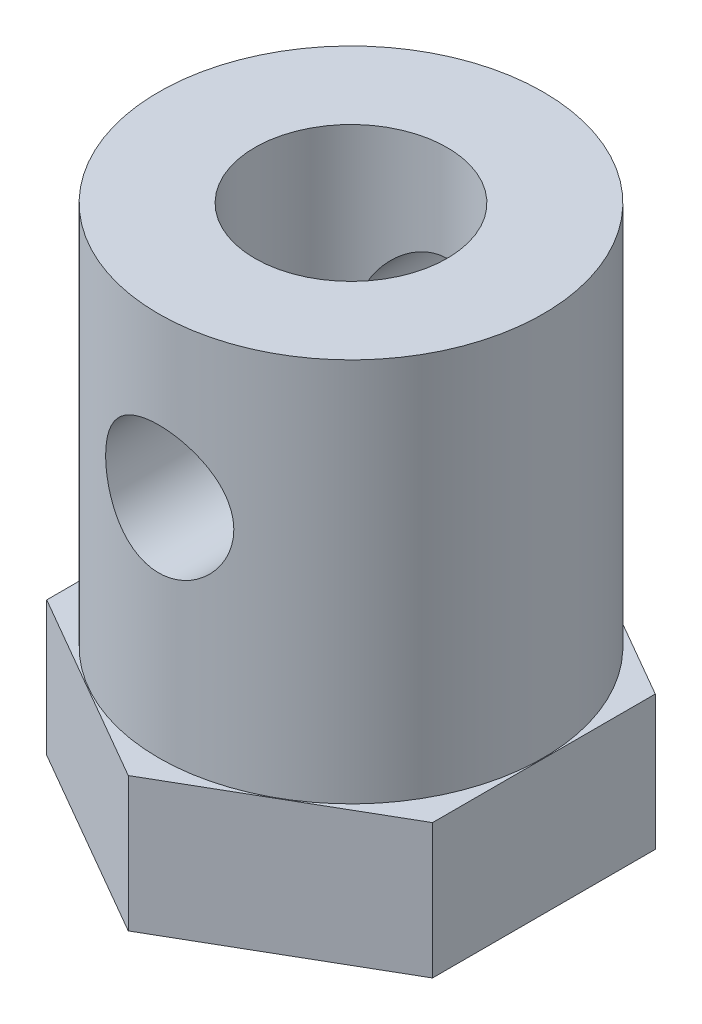
ISO-10303-21;
HEADER;
FILE_DESCRIPTION(('STEP AP214'),'2;1');
FILE_NAME('part.step','',(''),(''),'','','');
FILE_SCHEMA(('AUTOMOTIVE_DESIGN { 1 0 10303 214 1 1 1 1 }'));
ENDSEC;
DATA;
#1=APPLICATION_CONTEXT('core data for automotive mechanical design processes');
#2=APPLICATION_PROTOCOL_DEFINITION('international standard','automotive_design',2000,#1);
#3=PRODUCT_CONTEXT('',#1,'mechanical');
#4=PRODUCT('Part','Part','',(#3));
#5=PRODUCT_RELATED_PRODUCT_CATEGORY('part','',(#4));
#6=PRODUCT_DEFINITION_FORMATION('','',#4);
#7=PRODUCT_DEFINITION_CONTEXT('part definition',#1,'design');
#8=PRODUCT_DEFINITION('design','',#6,#7);
#9=PRODUCT_DEFINITION_SHAPE('','',#8);
#10=(LENGTH_UNIT() NAMED_UNIT(*) SI_UNIT(.MILLI.,.METRE.));
#11=(NAMED_UNIT(*) PLANE_ANGLE_UNIT() SI_UNIT($,.RADIAN.));
#12=(NAMED_UNIT(*) SI_UNIT($,.STERADIAN.) SOLID_ANGLE_UNIT());
#13=UNCERTAINTY_MEASURE_WITH_UNIT(LENGTH_MEASURE(1.E-05),#10,'distance_accuracy_value','');
#14=(GEOMETRIC_REPRESENTATION_CONTEXT(3) GLOBAL_UNCERTAINTY_ASSIGNED_CONTEXT((#13)) GLOBAL_UNIT_ASSIGNED_CONTEXT((#10,
#11,#12)) REPRESENTATION_CONTEXT('',''));
#15=CARTESIAN_POINT('',(0.,0.,0.));
#16=DIRECTION('',(0.,0.,1.));
#17=DIRECTION('',(1.,0.,0.));
#18=AXIS2_PLACEMENT_3D('',#15,#16,#17);
#19=CARTESIAN_POINT('',(6.01999999999996,4.2,-3.47564862052162));
#20=DIRECTION('',(-0.499999999999995,0.,0.866025403784442));
#21=DIRECTION('',(0.866025403784442,0.,0.499999999999995));
#22=AXIS2_PLACEMENT_3D('',#19,#20,#21);
#23=PLANE('',#22);
#24=DIRECTION('',(-0.866025403784442,0.,-0.499999999999995));
#25=VECTOR('',#24,1.);
#26=CARTESIAN_POINT('',(6.01999999999996,0.,-3.47564862052162));
#27=LINE('',#26,#25);
#28=CARTESIAN_POINT('',(6.01999999999996,0.,-3.47564862052162));
#29=VERTEX_POINT('',#28);
#30=CARTESIAN_POINT('',(0.,0.,-6.9512972410431));
#31=VERTEX_POINT('',#30);
#32=EDGE_CURVE('E131',#29,#31,#27,.T.);
#33=ORIENTED_EDGE('',*,*,#32,.T.);
#34=DIRECTION('',(0.,-1.,0.));
#35=VECTOR('',#34,1.);
#36=CARTESIAN_POINT('',(0.,4.2,-6.9512972410431));
#37=LINE('',#36,#35);
#38=CARTESIAN_POINT('',(0.,4.2,-6.9512972410431));
#39=VERTEX_POINT('',#38);
#40=EDGE_CURVE('E53',#39,#31,#37,.T.);
#41=ORIENTED_EDGE('',*,*,#40,.F.);
#42=DIRECTION('',(-0.866025403784442,0.,-0.499999999999995));
#43=VECTOR('',#42,1.);
#44=CARTESIAN_POINT('',(6.01999999999996,4.2,-3.47564862052162));
#45=LINE('',#44,#43);
#46=CARTESIAN_POINT('',(6.01999999999996,4.2,-3.47564862052162));
#47=VERTEX_POINT('',#46);
#48=EDGE_CURVE('E142',#47,#39,#45,.T.);
#49=ORIENTED_EDGE('',*,*,#48,.F.);
#50=DIRECTION('',(0.,-1.,0.));
#51=VECTOR('',#50,1.);
#52=CARTESIAN_POINT('',(6.01999999999996,4.2,-3.47564862052162));
#53=LINE('',#52,#51);
#54=EDGE_CURVE('E127',#47,#29,#53,.T.);
#55=ORIENTED_EDGE('',*,*,#54,.T.);
#56=EDGE_LOOP('',(#33,#41,#49,#55));
#57=FACE_BOUND('',#56,.T.);
#58=ADVANCED_FACE('F39',(#57),#23,.F.);
#59=CARTESIAN_POINT('',(0.,4.2,-6.9512972410431));
#60=DIRECTION('',(0.500000000000001,0.,0.866025403784438));
#61=DIRECTION('',(0.866025403784438,0.,-0.500000000000001));
#62=AXIS2_PLACEMENT_3D('',#59,#60,#61);
#63=PLANE('',#62);
#64=DIRECTION('',(-0.866025403784438,0.,0.500000000000001));
#65=VECTOR('',#64,1.);
#66=CARTESIAN_POINT('',(0.,0.,-6.9512972410431));
#67=LINE('',#66,#65);
#68=CARTESIAN_POINT('',(-6.02000000000001,0.,-3.47564862052153));
#69=VERTEX_POINT('',#68);
#70=EDGE_CURVE('E134',#31,#69,#67,.T.);
#71=ORIENTED_EDGE('',*,*,#70,.T.);
#72=DIRECTION('',(0.,-1.,0.));
#73=VECTOR('',#72,1.);
#74=CARTESIAN_POINT('',(-6.02000000000001,4.2,-3.47564862052153));
#75=LINE('',#74,#73);
#76=CARTESIAN_POINT('',(-6.02000000000001,4.2,-3.47564862052153));
#77=VERTEX_POINT('',#76);
#78=EDGE_CURVE('E146',#77,#69,#75,.T.);
#79=ORIENTED_EDGE('',*,*,#78,.F.);
#80=DIRECTION('',(-0.866025403784438,0.,0.500000000000001));
#81=VECTOR('',#80,1.);
#82=CARTESIAN_POINT('',(0.,4.2,-6.9512972410431));
#83=LINE('',#82,#81);
#84=EDGE_CURVE('E100',#39,#77,#83,.T.);
#85=ORIENTED_EDGE('',*,*,#84,.F.);
#86=ORIENTED_EDGE('',*,*,#40,.T.);
#87=EDGE_LOOP('',(#71,#79,#85,#86));
#88=FACE_BOUND('',#87,.T.);
#89=ADVANCED_FACE('F201',(#88),#63,.F.);
#90=CARTESIAN_POINT('',(-6.02000000000001,4.2,-3.47564862052153));
#91=DIRECTION('',(1.,0.,0.));
#92=DIRECTION('',(0.,0.,-1.));
#93=AXIS2_PLACEMENT_3D('',#90,#91,#92);
#94=PLANE('',#93);
#95=DIRECTION('',(0.,0.,1.));
#96=VECTOR('',#95,1.);
#97=CARTESIAN_POINT('',(-6.02000000000001,0.,-3.47564862052153));
#98=LINE('',#97,#96);
#99=CARTESIAN_POINT('',(-6.01999999999999,0.,3.47564862052158));
#100=VERTEX_POINT('',#99);
#101=EDGE_CURVE('E137',#69,#100,#98,.T.);
#102=ORIENTED_EDGE('',*,*,#101,.T.);
#103=DIRECTION('',(0.,-1.,0.));
#104=VECTOR('',#103,1.);
#105=CARTESIAN_POINT('',(-6.01999999999999,4.2,3.47564862052158));
#106=LINE('',#105,#104);
#107=CARTESIAN_POINT('',(-6.01999999999999,4.2,3.47564862052158));
#108=VERTEX_POINT('',#107);
#109=EDGE_CURVE('E122',#108,#100,#106,.T.);
#110=ORIENTED_EDGE('',*,*,#109,.F.);
#111=DIRECTION('',(0.,0.,1.));
#112=VECTOR('',#111,1.);
#113=CARTESIAN_POINT('',(-6.02000000000001,4.2,-3.47564862052153));
#114=LINE('',#113,#112);
#115=EDGE_CURVE('E113',#77,#108,#114,.T.);
#116=ORIENTED_EDGE('',*,*,#115,.F.);
#117=ORIENTED_EDGE('',*,*,#78,.T.);
#118=EDGE_LOOP('',(#102,#110,#116,#117));
#119=FACE_BOUND('',#118,.T.);
#120=ADVANCED_FACE('F199',(#119),#94,.F.);
#121=CARTESIAN_POINT('',(-6.01999999999999,4.2,3.47564862052158));
#122=DIRECTION('',(0.499999999999995,0.,-0.866025403784442));
#123=DIRECTION('',(-0.866025403784442,0.,-0.499999999999995));
#124=AXIS2_PLACEMENT_3D('',#121,#122,#123);
#125=PLANE('',#124);
#126=DIRECTION('',(0.866025403784442,0.,0.499999999999995));
#127=VECTOR('',#126,1.);
#128=CARTESIAN_POINT('',(-6.01999999999999,0.,3.47564862052158));
#129=LINE('',#128,#127);
#130=CARTESIAN_POINT('',(0.,0.,6.9512972410431));
#131=VERTEX_POINT('',#130);
#132=EDGE_CURVE('E121',#100,#131,#129,.T.);
#133=ORIENTED_EDGE('',*,*,#132,.T.);
#134=DIRECTION('',(0.,-1.,0.));
#135=VECTOR('',#134,1.);
#136=CARTESIAN_POINT('',(0.,4.2,6.9512972410431));
#137=LINE('',#136,#135);
#138=CARTESIAN_POINT('',(0.,4.2,6.9512972410431));
#139=VERTEX_POINT('',#138);
#140=EDGE_CURVE('E118',#139,#131,#137,.T.);
#141=ORIENTED_EDGE('',*,*,#140,.F.);
#142=DIRECTION('',(0.866025403784442,0.,0.499999999999995));
#143=VECTOR('',#142,1.);
#144=CARTESIAN_POINT('',(-6.01999999999999,4.2,3.47564862052158));
#145=LINE('',#144,#143);
#146=EDGE_CURVE('E107',#108,#139,#145,.T.);
#147=ORIENTED_EDGE('',*,*,#146,.F.);
#148=ORIENTED_EDGE('',*,*,#109,.T.);
#149=EDGE_LOOP('',(#133,#141,#147,#148));
#150=FACE_BOUND('',#149,.T.);
#151=ADVANCED_FACE('F119',(#150),#125,.F.);
#152=CARTESIAN_POINT('',(0.,4.2,6.9512972410431));
#153=DIRECTION('',(-0.500000000000007,0.,-0.866025403784435));
#154=DIRECTION('',(-0.866025403784435,0.,0.500000000000007));
#155=AXIS2_PLACEMENT_3D('',#152,#153,#154);
#156=PLANE('',#155);
#157=DIRECTION('',(0.866025403784435,0.,-0.500000000000007));
#158=VECTOR('',#157,1.);
#159=CARTESIAN_POINT('',(0.,0.,6.9512972410431));
#160=LINE('',#159,#158);
#161=CARTESIAN_POINT('',(6.02000000000004,0.,3.47564862052149));
#162=VERTEX_POINT('',#161);
#163=EDGE_CURVE('E85',#131,#162,#160,.T.);
#164=ORIENTED_EDGE('',*,*,#163,.T.);
#165=DIRECTION('',(0.,-1.,0.));
#166=VECTOR('',#165,1.);
#167=CARTESIAN_POINT('',(6.02000000000004,4.2,3.47564862052149));
#168=LINE('',#167,#166);
#169=CARTESIAN_POINT('',(6.02000000000004,4.2,3.47564862052149));
#170=VERTEX_POINT('',#169);
#171=EDGE_CURVE('E123',#170,#162,#168,.T.);
#172=ORIENTED_EDGE('',*,*,#171,.F.);
#173=DIRECTION('',(0.866025403784435,0.,-0.500000000000007));
#174=VECTOR('',#173,1.);
#175=CARTESIAN_POINT('',(0.,4.2,6.9512972410431));
#176=LINE('',#175,#174);
#177=EDGE_CURVE('E111',#139,#170,#176,.T.);
#178=ORIENTED_EDGE('',*,*,#177,.F.);
#179=ORIENTED_EDGE('',*,*,#140,.T.);
#180=EDGE_LOOP('',(#164,#172,#178,#179));
#181=FACE_BOUND('',#180,.T.);
#182=ADVANCED_FACE('F125',(#181),#156,.F.);
#183=CARTESIAN_POINT('',(6.02000000000004,4.2,3.47564862052149));
#184=DIRECTION('',(-1.,0.,0.));
#185=DIRECTION('',(0.,0.,1.));
#186=AXIS2_PLACEMENT_3D('',#183,#184,#185);
#187=PLANE('',#186);
#188=DIRECTION('',(0.,0.,-1.));
#189=VECTOR('',#188,1.);
#190=CARTESIAN_POINT('',(6.02000000000004,0.,3.47564862052149));
#191=LINE('',#190,#189);
#192=EDGE_CURVE('E91',#162,#29,#191,.T.);
#193=ORIENTED_EDGE('',*,*,#192,.T.);
#194=ORIENTED_EDGE('',*,*,#54,.F.);
#195=DIRECTION('',(0.,0.,-1.));
#196=VECTOR('',#195,1.);
#197=CARTESIAN_POINT('',(6.02000000000004,4.2,3.47564862052149));
#198=LINE('',#197,#196);
#199=EDGE_CURVE('E62',#170,#47,#198,.T.);
#200=ORIENTED_EDGE('',*,*,#199,.F.);
#201=ORIENTED_EDGE('',*,*,#171,.T.);
#202=EDGE_LOOP('',(#193,#194,#200,#201));
#203=FACE_BOUND('',#202,.T.);
#204=ADVANCED_FACE('F188',(#203),#187,.F.);
#205=CARTESIAN_POINT('',(0.,4.2,0.));
#206=DIRECTION('',(0.,1.,0.));
#207=DIRECTION('',(0.,0.,1.));
#208=AXIS2_PLACEMENT_3D('',#205,#206,#207);
#209=PLANE('',#208);
#210=CARTESIAN_POINT('',(0.,4.2,0.));
#211=DIRECTION('',(0.,1.,0.));
#212=DIRECTION('',(0.,0.,1.));
#213=AXIS2_PLACEMENT_3D('',#210,#211,#212);
#214=CIRCLE('',#213,6.);
#215=CARTESIAN_POINT('',(0.,4.2,6.));
#216=VERTEX_POINT('',#215);
#217=EDGE_CURVE('E11',#216,#216,#214,.T.);
#218=ORIENTED_EDGE('',*,*,#217,.F.);
#219=EDGE_LOOP('',(#218));
#220=FACE_BOUND('',#219,.T.);
#221=ORIENTED_EDGE('',*,*,#48,.T.);
#222=ORIENTED_EDGE('',*,*,#84,.T.);
#223=ORIENTED_EDGE('',*,*,#115,.T.);
#224=ORIENTED_EDGE('',*,*,#146,.T.);
#225=ORIENTED_EDGE('',*,*,#177,.T.);
#226=ORIENTED_EDGE('',*,*,#199,.T.);
#227=EDGE_LOOP('',(#221,#222,#223,#224,#225,#226));
#228=FACE_BOUND('',#227,.T.);
#229=ADVANCED_FACE('F109',(#220,#228),#209,.T.);
#230=CARTESIAN_POINT('',(0.,0.,0.));
#231=DIRECTION('',(0.,1.,0.));
#232=DIRECTION('',(0.,0.,1.));
#233=AXIS2_PLACEMENT_3D('',#230,#231,#232);
#234=PLANE('',#233);
#235=CARTESIAN_POINT('',(0.,0.,0.));
#236=DIRECTION('',(0.,1.,0.));
#237=DIRECTION('',(0.,0.,1.));
#238=AXIS2_PLACEMENT_3D('',#235,#236,#237);
#239=CIRCLE('',#238,3.);
#240=CARTESIAN_POINT('',(0.,0.,3.));
#241=VERTEX_POINT('',#240);
#242=EDGE_CURVE('E218',#241,#241,#239,.T.);
#243=ORIENTED_EDGE('',*,*,#242,.T.);
#244=EDGE_LOOP('',(#243));
#245=FACE_BOUND('',#244,.T.);
#246=ORIENTED_EDGE('',*,*,#32,.F.);
#247=ORIENTED_EDGE('',*,*,#192,.F.);
#248=ORIENTED_EDGE('',*,*,#163,.F.);
#249=ORIENTED_EDGE('',*,*,#132,.F.);
#250=ORIENTED_EDGE('',*,*,#101,.F.);
#251=ORIENTED_EDGE('',*,*,#70,.F.);
#252=EDGE_LOOP('',(#246,#247,#248,#249,#250,#251));
#253=FACE_BOUND('',#252,.T.);
#254=ADVANCED_FACE('F183',(#245,#253),#234,.F.);
#255=CARTESIAN_POINT('',(0.,16.2,0.));
#256=DIRECTION('',(0.,-1.,0.));
#257=DIRECTION('',(0.,0.,-1.));
#258=AXIS2_PLACEMENT_3D('',#255,#256,#257);
#259=CYLINDRICAL_SURFACE('',#258,6.);
#260=CARTESIAN_POINT('',(0.,13.2,-6.));
#261=CARTESIAN_POINT('',(-0.109126725773446,13.2000005074633,-6.00000030601888));
#262=CARTESIAN_POINT('',(-0.2182503890771,13.1910394677456,-5.9969953901509));
#263=CARTESIAN_POINT('',(-0.433283521745945,13.1555417823656,-5.98530420406562));
#264=CARTESIAN_POINT('',(-0.539192656237636,13.1290033121022,-5.97661734404305));
#265=CARTESIAN_POINT('',(-0.744665579003553,13.0593615132319,-5.95450615812885));
#266=CARTESIAN_POINT('',(-0.844239651772069,13.0162858750815,-5.94108975461707));
#267=CARTESIAN_POINT('',(-1.03474987361065,12.9149176543233,-5.91088891434684));
#268=CARTESIAN_POINT('',(-1.12568431391741,12.8566220699948,-5.89410381335556));
#269=CARTESIAN_POINT('',(-1.29948335004453,12.7243483902825,-5.8582818888601));
#270=CARTESIAN_POINT('',(-1.38200740059662,12.649937531479,-5.8391911292757));
#271=CARTESIAN_POINT('',(-1.53366538540417,12.4884656905869,-5.80120629566243));
#272=CARTESIAN_POINT('',(-1.60279637097892,12.401401930143,-5.78231226581098));
#273=CARTESIAN_POINT('',(-1.72764988445572,12.2140297696071,-5.74626664954548));
#274=CARTESIAN_POINT('',(-1.78292971644206,12.1134125205358,-5.72918078551376));
#275=CARTESIAN_POINT('',(-1.87563774775544,11.9036478110829,-5.69950610837202));
#276=CARTESIAN_POINT('',(-1.91307139477353,11.7945029656745,-5.68691592321491));
#277=CARTESIAN_POINT('',(-1.96774692301833,11.5746535570066,-5.66822606538755));
#278=CARTESIAN_POINT('',(-1.98562689654354,11.4641255830219,-5.66192191539223));
#279=CARTESIAN_POINT('',(-2.00268224666895,11.2414724916882,-5.65591313259015));
#280=CARTESIAN_POINT('',(-2.00186340320944,11.1293478785816,-5.6562064604546));
#281=CARTESIAN_POINT('',(-1.98203980740684,10.912126739112,-5.6631803001636));
#282=CARTESIAN_POINT('',(-1.96386782633399,10.806943194162,-5.66956831735066));
#283=CARTESIAN_POINT('',(-1.91121232569883,10.6012131607863,-5.68753315449102));
#284=CARTESIAN_POINT('',(-1.87672685318374,10.5006672291299,-5.69911059568215));
#285=CARTESIAN_POINT('',(-1.79187811612042,10.305174500817,-5.72635822262498));
#286=CARTESIAN_POINT('',(-1.74126809741452,10.2103439490609,-5.74209131586235));
#287=CARTESIAN_POINT('',(-1.62577821260628,10.0302581834405,-5.77585117151453));
#288=CARTESIAN_POINT('',(-1.56089422472801,9.94500574613324,-5.79387859580927));
#289=CARTESIAN_POINT('',(-1.41469866536447,9.78181680367845,-5.83134658335482));
#290=CARTESIAN_POINT('',(-1.33270630015262,9.70449461098186,-5.85081178709686));
#291=CARTESIAN_POINT('',(-1.15667913994012,9.5645374666732,-5.88813876774074));
#292=CARTESIAN_POINT('',(-1.06264319132163,9.50190392367101,-5.90600039076135));
#293=CARTESIAN_POINT('',(-0.863895226092532,9.39260739952986,-5.93834215875587));
#294=CARTESIAN_POINT('',(-0.75908655283267,9.34610901731854,-5.95278700016079));
#295=CARTESIAN_POINT('',(-0.542538166729012,9.27159365208858,-5.9764113428887));
#296=CARTESIAN_POINT('',(-0.430800876309904,9.24357024915312,-5.98559267309759));
#297=CARTESIAN_POINT('',(-0.208767659058605,9.20788866795528,-5.99735254142881));
#298=CARTESIAN_POINT('',(-0.0986191997296893,9.1994003816545,-6.00020003667456));
#299=CARTESIAN_POINT('',(0.121550139920478,9.20066534719694,-5.99977805389655));
#300=CARTESIAN_POINT('',(0.231571038639304,9.21041551995975,-5.99650960838725));
#301=CARTESIAN_POINT('',(0.445039732608514,9.24722381547192,-5.98440049434209));
#302=CARTESIAN_POINT('',(0.548585613669689,9.27377241209899,-5.97572397422385));
#303=CARTESIAN_POINT('',(0.749711917159149,9.34278688893346,-5.9538369366014));
#304=CARTESIAN_POINT('',(0.847291577017215,9.38525479893557,-5.9406258409335));
#305=CARTESIAN_POINT('',(1.03657659278655,9.48614086368157,-5.91057862574579));
#306=CARTESIAN_POINT('',(1.1280599184343,9.54494918656634,-5.89365629511572));
#307=CARTESIAN_POINT('',(1.30012966027118,9.67638830002697,-5.85810507832525));
#308=CARTESIAN_POINT('',(1.38071273559116,9.74902331206353,-5.83947567187655));
#309=CARTESIAN_POINT('',(1.5325050156126,9.90995750201318,-5.80153695960889));
#310=CARTESIAN_POINT('',(1.60312193849154,9.99881845385372,-5.78223522174856));
#311=CARTESIAN_POINT('',(1.72851504464715,10.1875431356218,-5.74599946589417));
#312=CARTESIAN_POINT('',(1.78329109586203,10.2874069572682,-5.72906546764005));
#313=CARTESIAN_POINT('',(1.87519386083272,10.4953460305798,-5.69964783582767));
#314=CARTESIAN_POINT('',(1.91235626433004,10.6034041583375,-5.68715521585958));
#315=CARTESIAN_POINT('',(1.96778933351871,10.8247573000883,-5.66821664612899));
#316=CARTESIAN_POINT('',(1.98606850990788,10.9380499308087,-5.66176797247279));
#317=CARTESIAN_POINT('',(2.00255256495469,11.1603941920818,-5.65595717748354));
#318=CARTESIAN_POINT('',(2.0017405146168,11.2693646805736,-5.6562480051483));
#319=CARTESIAN_POINT('',(1.98248458689739,11.4855301498441,-5.66302539647735));
#320=CARTESIAN_POINT('',(1.96404175891717,11.5927252359102,-5.66951159138723));
#321=CARTESIAN_POINT('',(1.91074362625869,11.8002713260049,-5.68769048609783));
#322=CARTESIAN_POINT('',(1.87620669203103,11.900713650009,-5.69928196044955));
#323=CARTESIAN_POINT('',(1.79195873151949,12.0944548138765,-5.72632797636937));
#324=CARTESIAN_POINT('',(1.74224433710761,12.187752062376,-5.74178337526786));
#325=CARTESIAN_POINT('',(1.62652138516686,12.3689673398458,-5.77565658452093));
#326=CARTESIAN_POINT('',(1.55989648552916,12.4564730037968,-5.79417423284274));
#327=CARTESIAN_POINT('',(1.4132857662713,12.6193796267684,-5.83166712566506));
#328=CARTESIAN_POINT('',(1.33329616890296,12.6947771513762,-5.85064249824745));
#329=CARTESIAN_POINT('',(1.15848311384137,12.8342888245784,-5.88780061051088));
#330=CARTESIAN_POINT('',(1.06320302699946,12.897848695502,-5.90592363602513));
#331=CARTESIAN_POINT('',(0.862714714813247,13.0079808577013,-5.93851982345224));
#332=CARTESIAN_POINT('',(0.757509036264695,13.0545574918441,-5.9529939181586));
#333=CARTESIAN_POINT('',(0.54498729440195,13.1274432649773,-5.97611030137084));
#334=CARTESIAN_POINT('',(0.437975515352816,13.1545649325268,-5.98498424845045));
#335=CARTESIAN_POINT('',(0.220640832020493,13.1908405613543,-5.99692814128444));
#336=CARTESIAN_POINT('',(0.110318851137493,13.1999994869931,-5.9999996906381));
#337=CARTESIAN_POINT('',(0.,13.2,-6.));
#338=B_SPLINE_CURVE_WITH_KNOTS('',3,(#260,#261,#262,#263,#264,#265,#266,#267,#268,#269,#270,
#271,#272,#273,#274,#275,#276,#277,#278,#279,#280,#281,#282,#283,#284,#285,#286,#287,#288,#289,
#290,#291,#292,#293,#294,#295,#296,#297,#298,#299,#300,#301,#302,#303,#304,#305,#306,#307,#308,
#309,#310,#311,#312,#313,#314,#315,#316,#317,#318,#319,#320,#321,#322,#323,#324,#325,#326,#327,
#328,#329,#330,#331,#332,#333,#334,#335,#336,#337),.UNSPECIFIED.,.T.,.F.,(4,2,2,2,2,2,2,2,2,2,2,
2,2,2,2,2,2,2,2,2,2,2,2,2,2,2,2,2,2,2,2,2,2,2,2,2,2,2,4),(0.,0.326974212052022,
0.653982370535042,0.980445345740548,1.3069727555982,1.64369368565512,1.98048866575061,
2.32696769646941,2.67334089385667,3.0080385148368,3.34263267974971,3.66193653102561,
3.98127861710964,4.30576342310261,4.63034205116414,4.97186611622734,5.31342291933237,
5.65836811300715,6.00319337754417,6.33307166350339,6.66289426328353,6.98316315956427,
7.30347290568208,7.63220799687473,7.96104361643783,8.30482045761504,8.64860016469993,
8.99168027653541,9.33460569411681,9.65991332128517,9.98520158702751,10.3043117416084,
10.6234927635196,10.9566013338361,11.2898042224756,11.635993216702,11.9820936230491,
12.3127311674763,12.6432773207628),.UNSPECIFIED.);
#339=CARTESIAN_POINT('',(0.,13.2,-6.));
#340=VERTEX_POINT('',#339);
#341=EDGE_CURVE('E173',#340,#340,#338,.T.);
#342=ORIENTED_EDGE('',*,*,#341,.T.);
#343=EDGE_LOOP('',(#342));
#344=FACE_BOUND('',#343,.T.);
#345=CARTESIAN_POINT('',(2.,11.2,5.65685424949238));
#346=CARTESIAN_POINT('',(2.00000051589543,11.0910636503279,5.65685389060868));
#347=CARTESIAN_POINT('',(1.99106956737105,10.9821304003528,5.66003538581715));
#348=CARTESIAN_POINT('',(1.95570226337762,10.7674911580115,5.6723514816251));
#349=CARTESIAN_POINT('',(1.92926302433679,10.6617857002551,5.68148706284377));
#350=CARTESIAN_POINT('',(1.85991097136981,10.4567462140054,5.70456407377583));
#351=CARTESIAN_POINT('',(1.81703044280649,10.3574001411146,5.71849607942644));
#352=CARTESIAN_POINT('',(1.71612325688276,10.1672799029041,5.74958244020649));
#353=CARTESIAN_POINT('',(1.65809325772037,10.0765076348927,5.76673750607225));
#354=CARTESIAN_POINT('',(1.52610229288576,9.90256007532337,5.80308978814946));
#355=CARTESIAN_POINT('',(1.45164868275584,9.81976914265654,5.82233789689288));
#356=CARTESIAN_POINT('',(1.28997533442879,9.66758639755072,5.86027729602006));
#357=CARTESIAN_POINT('',(1.20275355010475,9.59819673683526,5.87896849657923));
#358=CARTESIAN_POINT('',(1.01520901593002,9.47304220534081,5.91427733843598));
#359=CARTESIAN_POINT('',(0.914603822449049,9.41768005876408,5.93082815403211));
#360=CARTESIAN_POINT('',(0.704862445974946,9.32481682974498,5.95939173541966));
#361=CARTESIAN_POINT('',(0.595728571374422,9.28731093364619,5.97140572406004));
#362=CARTESIAN_POINT('',(0.376057634866987,9.23252829073521,5.98918150863813));
#363=CARTESIAN_POINT('',(0.265701509705936,9.21459310748599,5.99514629555118));
#364=CARTESIAN_POINT('',(0.0433957496481781,9.19736741327868,6.00087216436496));
#365=CARTESIAN_POINT('',(-0.0685534670877934,9.19807209669517,6.00063484525791));
#366=CARTESIAN_POINT('',(-0.28620703038763,9.21768850913206,5.99412079237463));
#367=CARTESIAN_POINT('',(-0.391984097183314,9.23588505694898,5.98808129510235));
#368=CARTESIAN_POINT('',(-0.598886877644344,9.28878596196095,5.97093934679463));
#369=CARTESIAN_POINT('',(-0.700012275558432,9.32349143795965,5.95983655262364));
#370=CARTESIAN_POINT('',(-0.896304949683946,9.40884263461212,5.93351340586448));
#371=CARTESIAN_POINT('',(-0.991376441937691,9.45969187709302,5.91824085048031));
#372=CARTESIAN_POINT('',(-1.17184865105465,9.57571941089731,5.88516786077838));
#373=CARTESIAN_POINT('',(-1.25724666877068,9.64090168665526,5.86736672402934));
#374=CARTESIAN_POINT('',(-1.42020173310262,9.7873487869194,5.83012383699793));
#375=CARTESIAN_POINT('',(-1.49720031413054,9.86922631568296,5.81064430337755));
#376=CARTESIAN_POINT('',(-1.63655451919635,10.0448974514532,5.77294670497801));
#377=CARTESIAN_POINT('',(-1.69890788656309,10.1386928914561,5.75472883491231));
#378=CARTESIAN_POINT('',(-1.80797491007149,10.3373072512069,5.72141050242225));
#379=CARTESIAN_POINT('',(-1.85445292724268,10.4422642626356,5.70635818569496));
#380=CARTESIAN_POINT('',(-1.92888638653867,10.6591427884288,5.6816330164877));
#381=CARTESIAN_POINT('',(-1.95684959149499,10.7710613624125,5.67195790974185));
#382=CARTESIAN_POINT('',(-1.99232256419504,10.9932767108232,5.6595927263117));
#383=CARTESIAN_POINT('',(-2.00069819101526,11.1034188494973,5.65660720637512));
#384=CARTESIAN_POINT('',(-1.99921087781944,11.3235522982282,5.65713344118369));
#385=CARTESIAN_POINT('',(-1.98935125045352,11.433543632048,5.66064401583629));
#386=CARTESIAN_POINT('',(-1.95245130310462,11.6463139314238,5.67347236180599));
#387=CARTESIAN_POINT('',(-1.92601278796137,11.7492108603017,5.68258650881681));
#388=CARTESIAN_POINT('',(-1.85742772512093,11.9490872124784,5.70537107342046));
#389=CARTESIAN_POINT('',(-1.81527839272684,12.0460655831816,5.71904229869679));
#390=CARTESIAN_POINT('',(-1.71494868147787,12.234760841694,5.74993755191574));
#391=CARTESIAN_POINT('',(-1.65630223671699,12.3262132852836,5.76726051331257));
#392=CARTESIAN_POINT('',(-1.52517126111511,12.4982921047674,5.80331537461931));
#393=CARTESIAN_POINT('',(-1.45268265099756,12.5789152773224,5.82204768887589));
#394=CARTESIAN_POINT('',(-1.29178341180065,12.7310559681813,5.85990077275698));
#395=CARTESIAN_POINT('',(-1.2027745410933,12.8019487800377,5.87899687155793));
#396=CARTESIAN_POINT('',(-1.01365458280051,12.9278322846961,5.91453703226218));
#397=CARTESIAN_POINT('',(-0.913543889729102,12.9828235423248,5.9309811883539));
#398=CARTESIAN_POINT('',(-0.70555972486459,13.0748402097234,5.95928811621206));
#399=CARTESIAN_POINT('',(-0.597742246642391,13.1119825542961,5.97118060009062));
#400=CARTESIAN_POINT('',(-0.376916931692031,13.1674554841202,5.98917221675549));
#401=CARTESIAN_POINT('',(-0.263910983907777,13.185792859761,5.99527344068038));
#402=CARTESIAN_POINT('',(-0.0416306717200794,13.2025241552113,6.00083726472513));
#403=CARTESIAN_POINT('',(0.0675694478400396,13.2018149078648,6.00059840178878));
#404=CARTESIAN_POINT('',(0.28422229000035,13.1826853837072,5.99424393038796));
#405=CARTESIAN_POINT('',(0.391675153638116,13.1642665436945,5.98812879867152));
#406=CARTESIAN_POINT('',(0.60008423886412,13.1108355308481,5.97081829908825));
#407=CARTESIAN_POINT('',(0.70111654182558,13.0760915692941,5.95970516722297));
#408=CARTESIAN_POINT('',(0.895956701879593,12.9912449378057,5.9335432140899));
#409=CARTESIAN_POINT('',(0.989763248284866,12.941139489606,5.91849368096033));
#410=CARTESIAN_POINT('',(1.17126803261757,12.824860975796,5.88531737655762));
#411=CARTESIAN_POINT('',(1.25861250311522,12.7581626292367,5.86709744983853));
#412=CARTESIAN_POINT('',(1.42116205254486,12.6114852176876,5.82985977583759));
#413=CARTESIAN_POINT('',(1.49636324324919,12.5315019154745,5.81084177546194));
#414=CARTESIAN_POINT('',(1.63548361766624,12.3567812888261,5.77326559651196));
#415=CARTESIAN_POINT('',(1.6988459319958,12.2615889780467,5.75475455977261));
#416=CARTESIAN_POINT('',(1.80862868660223,12.0613311461944,5.72120386646031));
#417=CARTESIAN_POINT('',(1.85505355363895,11.9562682139407,5.70616330322499));
#418=CARTESIAN_POINT('',(1.92768765640833,11.7440763519687,5.68202668413029));
#419=CARTESIAN_POINT('',(1.95471581829904,11.6372554729493,5.67269265714364));
#420=CARTESIAN_POINT('',(1.99086864029853,11.4202878990666,5.66010767079036));
#421=CARTESIAN_POINT('',(1.99999947839319,11.3101423651786,5.65685461234922));
#422=CARTESIAN_POINT('',(2.,11.2,5.65685424949238));
#423=B_SPLINE_CURVE_WITH_KNOTS('',3,(#345,#346,#347,#348,#349,#350,#351,#352,#353,#354,#355,
#356,#357,#358,#359,#360,#361,#362,#363,#364,#365,#366,#367,#368,#369,#370,#371,#372,#373,#374,
#375,#376,#377,#378,#379,#380,#381,#382,#383,#384,#385,#386,#387,#388,#389,#390,#391,#392,#393,
#394,#395,#396,#397,#398,#399,#400,#401,#402,#403,#404,#405,#406,#407,#408,#409,#410,#411,#412,
#413,#414,#415,#416,#417,#418,#419,#420,#421,#422),.UNSPECIFIED.,.T.,.F.,(4,2,2,2,2,2,2,2,2,2,2,
2,2,2,2,2,2,2,2,2,2,2,2,2,2,2,2,2,2,2,2,2,2,2,2,2,2,2,4),(0.,0.326401169598712,
0.652856110030328,0.978673255001656,1.30456233237089,1.64202674855136,1.97954530343976,
2.32587012287315,2.67210152773578,3.00628637529869,3.34038506604655,3.66138009651138,
3.98239688378473,4.3076330972067,4.63295983748044,4.97360348727835,5.31429959224212,
5.65985279686111,6.00526102713232,6.33508582728879,6.66485071674468,6.98328791537552,
7.30178158293892,7.6303771547143,7.95906971324255,8.30357616342185,8.64807037515065,
8.99027582381703,9.33235766008313,9.65836169355271,9.98433928019562,10.3051391208086,
10.6259970152649,10.9587103904127,11.2915300886526,11.6373780547229,11.9831355653373,
12.3132642432538,12.6432789438093),.UNSPECIFIED.);
#424=CARTESIAN_POINT('',(2.,11.2,5.65685424949238));
#425=VERTEX_POINT('',#424);
#426=EDGE_CURVE('E167',#425,#425,#423,.T.);
#427=ORIENTED_EDGE('',*,*,#426,.T.);
#428=EDGE_LOOP('',(#427));
#429=FACE_BOUND('',#428,.T.);
#430=CARTESIAN_POINT('',(0.,16.2,0.));
#431=DIRECTION('',(0.,1.,0.));
#432=DIRECTION('',(0.,0.,1.));
#433=AXIS2_PLACEMENT_3D('',#430,#431,#432);
#434=CIRCLE('',#433,6.);
#435=CARTESIAN_POINT('',(0.,16.2,6.));
#436=VERTEX_POINT('',#435);
#437=EDGE_CURVE('E135',#436,#436,#434,.T.);
#438=ORIENTED_EDGE('',*,*,#437,.F.);
#439=EDGE_LOOP('',(#438));
#440=FACE_BOUND('',#439,.T.);
#441=ORIENTED_EDGE('',*,*,#217,.T.);
#442=EDGE_LOOP('',(#441));
#443=FACE_BOUND('',#442,.T.);
#444=ADVANCED_FACE('F178',(#344,#429,#440,#443),#259,.T.);
#445=CARTESIAN_POINT('',(0.,16.2,0.));
#446=DIRECTION('',(0.,1.,0.));
#447=DIRECTION('',(0.,0.,1.));
#448=AXIS2_PLACEMENT_3D('',#445,#446,#447);
#449=PLANE('',#448);
#450=CARTESIAN_POINT('',(0.,16.2,0.));
#451=DIRECTION('',(0.,1.,0.));
#452=DIRECTION('',(0.,0.,1.));
#453=AXIS2_PLACEMENT_3D('',#450,#451,#452);
#454=CIRCLE('',#453,3.);
#455=CARTESIAN_POINT('',(0.,16.2,3.));
#456=VERTEX_POINT('',#455);
#457=EDGE_CURVE('E219',#456,#456,#454,.T.);
#458=ORIENTED_EDGE('',*,*,#457,.F.);
#459=EDGE_LOOP('',(#458));
#460=FACE_BOUND('',#459,.T.);
#461=ORIENTED_EDGE('',*,*,#437,.T.);
#462=EDGE_LOOP('',(#461));
#463=FACE_BOUND('',#462,.T.);
#464=ADVANCED_FACE('F182',(#460,#463),#449,.T.);
#465=CARTESIAN_POINT('',(0.,0.,0.));
#466=DIRECTION('',(0.,1.,0.));
#467=DIRECTION('',(0.,0.,1.));
#468=AXIS2_PLACEMENT_3D('',#465,#466,#467);
#469=CYLINDRICAL_SURFACE('',#468,3.);
#470=CARTESIAN_POINT('',(0.,9.2,3.));
#471=CARTESIAN_POINT('',(0.100484716668077,9.19999945036752,3.0000004164484));
#472=CARTESIAN_POINT('',(0.200969087132901,9.2076139699555,2.99490802753388));
#473=CARTESIAN_POINT('',(0.39873305803168,9.23759686410566,2.97504652423809));
#474=CARTESIAN_POINT('',(0.496011113955006,9.25997224312329,2.96027281581235));
#475=CARTESIAN_POINT('',(0.684212307854248,9.31810771732484,2.92250482404708));
#476=CARTESIAN_POINT('',(0.775162872657554,9.35380514000794,2.89954905493315));
#477=CARTESIAN_POINT('',(0.949415290997259,9.4370633632715,2.8472613787744));
#478=CARTESIAN_POINT('',(1.03271603160967,9.48462588630056,2.8179285460551));
#479=CARTESIAN_POINT('',(1.19728470077011,9.59465693736743,2.75227329369838));
#480=CARTESIAN_POINT('',(1.27778030546068,9.65804786074289,2.71556897579319));
#481=CARTESIAN_POINT('',(1.42772804469274,9.79573004865845,2.63982313083466));
#482=CARTESIAN_POINT('',(1.49716405543888,9.87003692983774,2.60077830356832));
#483=CARTESIAN_POINT('',(1.63422297745496,10.0410523676127,2.51728264678794));
#484=CARTESIAN_POINT('',(1.6998318636275,10.1394456532035,2.47295067937795));
#485=CARTESIAN_POINT('',(1.81350357014175,10.3483633776465,2.3908414735282));
#486=CARTESIAN_POINT('',(1.86159673426503,10.4588664015627,2.35305295954668));
#487=CARTESIAN_POINT('',(1.92674035011438,10.6567112934216,2.29976266641461));
#488=CARTESIAN_POINT('',(1.94874447236008,10.7415284528739,2.28097627892403));
#489=CARTESIAN_POINT('',(1.98150617785228,10.9147445047416,2.25257969659604));
#490=CARTESIAN_POINT('',(1.99228314651963,11.0031369487261,2.24295368744147));
#491=CARTESIAN_POINT('',(2.00191364141227,11.1814747788565,2.23436605608045));
#492=CARTESIAN_POINT('',(2.00071842917524,11.2714250234524,2.23544802558502));
#493=CARTESIAN_POINT('',(1.98637581333356,11.4496349734998,2.24819775483425));
#494=CARTESIAN_POINT('',(1.97321828380393,11.5378931820281,2.25987448286881));
#495=CARTESIAN_POINT('',(1.93664994217326,11.7064670512419,2.29127185989959));
#496=CARTESIAN_POINT('',(1.91371711479477,11.7869613359388,2.31061488324375));
#497=CARTESIAN_POINT('',(1.85870118583424,11.9430236909758,2.35509622933623));
#498=CARTESIAN_POINT('',(1.8266150732855,12.0185901302387,2.3802364585489));
#499=CARTESIAN_POINT('',(1.74673818732648,12.1790253953564,2.43964196377947));
#500=CARTESIAN_POINT('',(1.69708052300445,12.2626599004831,2.47472317740626));
#501=CARTESIAN_POINT('',(1.58668960438221,12.4213833952857,2.54691537733438));
#502=CARTESIAN_POINT('',(1.52594268999614,12.4964616577621,2.58402882709328));
#503=CARTESIAN_POINT('',(1.37981165322309,12.6525425456034,2.66543343763724));
#504=CARTESIAN_POINT('',(1.29193938283656,12.7313340486828,2.7095474472056));
#505=CARTESIAN_POINT('',(1.10200799908008,12.8731964945385,2.79218100665211));
#506=CARTESIAN_POINT('',(0.999962299343701,12.936282145409,2.83070577648042));
#507=CARTESIAN_POINT('',(0.804857827096534,13.0334777186229,2.89145404090364));
#508=CARTESIAN_POINT('',(0.713957643371914,13.0708433633389,2.9153926116554));
#509=CARTESIAN_POINT('',(0.526036043935485,13.1321049256254,2.95507719030499));
#510=CARTESIAN_POINT('',(0.429019879001654,13.1560122271322,2.97083012127543));
#511=CARTESIAN_POINT('',(0.230985453172284,13.189161165238,2.99275882156808));
#512=CARTESIAN_POINT('',(0.129951811934161,13.1983394609383,2.99889322461187));
#513=CARTESIAN_POINT('',(-0.0724415193893438,13.2012470885622,3.00083114965147));
#514=CARTESIAN_POINT('',(-0.173801186186623,13.1949775004888,2.99663539385634));
#515=CARTESIAN_POINT('',(-0.366455717204237,13.168375944438,2.97899589424273));
#516=CARTESIAN_POINT('',(-0.45795744467919,13.1490627022448,2.96622246390226));
#517=CARTESIAN_POINT('',(-0.636116392427398,13.0984043139871,2.93318449284837));
#518=CARTESIAN_POINT('',(-0.722772837571131,13.0670572490718,2.91291875746989));
#519=CARTESIAN_POINT('',(-0.894664750465994,12.9913477029551,2.86496352529158));
#520=CARTESIAN_POINT('',(-0.979496184631418,12.9463118459181,2.83689870135785));
#521=CARTESIAN_POINT('',(-1.14068302395729,12.8455667100537,2.77601855611511));
#522=CARTESIAN_POINT('',(-1.21703314820091,12.7898508394678,2.74320030403941));
#523=CARTESIAN_POINT('',(-1.37185445482324,12.6593921318425,2.6695454665343));
#524=CARTESIAN_POINT('',(-1.44875187569565,12.5830337399249,2.62826156800165));
#525=CARTESIAN_POINT('',(-1.58933968069449,12.4188885700429,2.54571173085958));
#526=CARTESIAN_POINT('',(-1.6530209365723,12.3310939608925,2.50444582417845));
#527=CARTESIAN_POINT('',(-1.76124776549313,12.1528575872319,2.4293967897058));
#528=CARTESIAN_POINT('',(-1.80695636125283,12.0632679665378,2.39527597025701));
#529=CARTESIAN_POINT('',(-1.88496213740264,11.8761273475564,2.33438974266155));
#530=CARTESIAN_POINT('',(-1.91728345682189,11.7785910616954,2.30761112529822));
#531=CARTESIAN_POINT('',(-1.9623584346534,11.5954355128046,2.26933208182633));
#532=CARTESIAN_POINT('',(-1.97758597566225,11.510828190124,2.25594998021257));
#533=CARTESIAN_POINT('',(-1.99699205923372,11.3394267186816,2.23879466438398));
#534=CARTESIAN_POINT('',(-2.00118260285317,11.2526350488605,2.23501101347816));
#535=CARTESIAN_POINT('',(-1.99823921981266,11.0793569432763,2.23764201149982));
#536=CARTESIAN_POINT('',(-1.99109858767783,10.9928707186262,2.24406269907463));
#537=CARTESIAN_POINT('',(-1.96596997224746,10.8226564714679,2.26610452403491));
#538=CARTESIAN_POINT('',(-1.94796751728258,10.7389322861757,2.28173793527615));
#539=CARTESIAN_POINT('',(-1.89593035657494,10.5542888135188,2.32526843904801));
#540=CARTESIAN_POINT('',(-1.85890187130765,10.4547322870567,2.35532333574983));
#541=CARTESIAN_POINT('',(-1.7708452623622,10.2645131656158,2.42222161121309));
#542=CARTESIAN_POINT('',(-1.71979748341259,10.1738633020083,2.459074496867));
#543=CARTESIAN_POINT('',(-1.60398280555153,10.0007181128638,2.53617186577119));
#544=CARTESIAN_POINT('',(-1.53898309894021,9.91840125457695,2.5764658739228));
#545=CARTESIAN_POINT('',(-1.39671768031095,9.76467752174207,2.65628301537844));
#546=CARTESIAN_POINT('',(-1.31944821025749,9.69327400297079,2.69580590832396));
#547=CARTESIAN_POINT('',(-1.14145732976974,9.55328789569092,2.77631551964082));
#548=CARTESIAN_POINT('',(-1.03896166955575,9.48658135982168,2.81669805449991));
#549=CARTESIAN_POINT('',(-0.820868555771217,9.3720867233347,2.88777665874161));
#550=CARTESIAN_POINT('',(-0.705292062449156,9.32426889317605,2.91848793445255));
#551=CARTESIAN_POINT('',(-0.491435069835745,9.25884542183622,2.96101644836895));
#552=CARTESIAN_POINT('',(-0.39501232525792,9.23688896090138,2.97551480368935));
#553=CARTESIAN_POINT('',(-0.199058012023945,9.2074719674619,2.99500280141853));
#554=CARTESIAN_POINT('',(-0.0995288361880074,9.20000054440399,2.99999958751315));
#555=CARTESIAN_POINT('',(0.,9.2,3.));
#556=B_SPLINE_CURVE_WITH_KNOTS('',3,(#470,#471,#472,#473,#474,#475,#476,#477,#478,#479,#480,
#481,#482,#483,#484,#485,#486,#487,#488,#489,#490,#491,#492,#493,#494,#495,#496,#497,#498,#499,
#500,#501,#502,#503,#504,#505,#506,#507,#508,#509,#510,#511,#512,#513,#514,#515,#516,#517,#518,
#519,#520,#521,#522,#523,#524,#525,#526,#527,#528,#529,#530,#531,#532,#533,#534,#535,#536,#537,
#538,#539,#540,#541,#542,#543,#544,#545,#546,#547,#548,#549,#550,#551,#552,#553,#554,#555),
.UNSPECIFIED.,.T.,.F.,(4,2,2,2,2,2,2,2,2,2,2,2,2,2,2,2,2,2,2,2,2,2,2,2,2,2,2,2,2,2,2,2,2,2,2,2,
2,2,2,2,2,2,4),(0.,0.301053226505399,0.602249414348688,0.902046153190231,1.20188643867386,
1.52717029000557,1.85292411604319,2.23006683295982,2.60655305445439,2.87433693676029,
3.14165767845809,3.41006711735378,3.67870397263352,3.93548862198022,4.19235783805079,
4.50147574660873,4.81097703780056,5.18718954496752,5.56304840301362,5.86524087696758,
6.16717735142813,6.4704088329425,6.77361911533414,7.05553084792472,7.3374875513827,
7.63652346829516,7.93574454945203,8.28228176141291,8.62905753175757,8.94649935304476,
9.26336626640723,9.52324048016134,9.78283200333091,10.0425772028455,10.302669238524,
10.6320660870419,10.9619271337795,11.2977924520448,11.6337608397015,12.0179535155883,
12.4015390656082,12.6999529136674,12.9981423125957),.UNSPECIFIED.);
#557=CARTESIAN_POINT('',(0.,9.2,3.));
#558=VERTEX_POINT('',#557);
#559=EDGE_CURVE('E42',#558,#558,#556,.T.);
#560=ORIENTED_EDGE('',*,*,#559,.T.);
#561=EDGE_LOOP('',(#560));
#562=FACE_BOUND('',#561,.T.);
#563=CARTESIAN_POINT('',(2.,11.2,-2.23606797749979));
#564=CARTESIAN_POINT('',(1.99999453997731,11.1023716891314,-2.23607753462817));
#565=CARTESIAN_POINT('',(1.99278992503664,11.0047092462912,-2.24258071047442));
#566=CARTESIAN_POINT('',(1.96458268317731,10.8128800883492,-2.26731972501617));
#567=CARTESIAN_POINT('',(1.94355530587862,10.7187199644704,-2.2855766081271));
#568=CARTESIAN_POINT('',(1.88935861676632,10.5372645581223,-2.3305658582557));
#569=CARTESIAN_POINT('',(1.85630718014214,10.4499123032623,-2.35721561794601));
#570=CARTESIAN_POINT('',(1.77934008393538,10.2821341676533,-2.41584094681825));
#571=CARTESIAN_POINT('',(1.73542216812163,10.2017097300235,-2.44781762158831));
#572=CARTESIAN_POINT('',(1.63002410007714,10.0363531123831,-2.51946072932026));
#573=CARTESIAN_POINT('',(1.56687435451732,9.9526678822828,-2.55954936090364));
#574=CARTESIAN_POINT('',(1.4281921974068,9.79599729112572,-2.63944827308083));
#575=CARTESIAN_POINT('',(1.3526477317708,9.72302247834147,-2.67925824297985));
#576=CARTESIAN_POINT('',(1.17815690494295,9.57935634121833,-2.76088818523747));
#577=CARTESIAN_POINT('',(1.07740643965819,9.51051748822433,-2.80216785846923));
#578=CARTESIAN_POINT('',(0.862470964212232,9.39135790450993,-2.87558484482764));
#579=CARTESIAN_POINT('',(0.748301152321705,9.34101648596881,-2.90773236231037));
#580=CARTESIAN_POINT('',(0.523249073480004,9.26644359898255,-2.95599907464725));
#581=CARTESIAN_POINT('',(0.413434725181417,9.23991665550444,-2.97351175615867));
#582=CARTESIAN_POINT('',(0.189695448729863,9.20581551071635,-2.99609745461921));
#583=CARTESIAN_POINT('',(0.075775881285826,9.19821744077456,-3.00118613762359));
#584=CARTESIAN_POINT('',(-0.134147050232329,9.20217244994905,-2.99855361722953));
#585=CARTESIAN_POINT('',(-0.230240638008752,9.21098905131706,-2.99266264910127));
#586=CARTESIAN_POINT('',(-0.419238633271015,9.24209105135891,-2.9720818279002));
#587=CARTESIAN_POINT('',(-0.512142807649723,9.26437743230354,-2.95739133313102));
#588=CARTESIAN_POINT('',(-0.692077937671169,9.32119568479458,-2.92052091703736));
#589=CARTESIAN_POINT('',(-0.779130623845962,9.35567888519856,-2.89837077982679));
#590=CARTESIAN_POINT('',(-0.946209150653556,9.43555364295282,-2.84821104476287));
#591=CARTESIAN_POINT('',(-1.0262337049694,9.48094719150151,-2.82020037745161));
#592=CARTESIAN_POINT('',(-1.18828429196344,9.58797873745989,-2.75618058450702));
#593=CARTESIAN_POINT('',(-1.26919148099708,9.65096752335279,-2.71960408792025));
#594=CARTESIAN_POINT('',(-1.41998807498305,9.78789867948032,-2.64400601826998));
#595=CARTESIAN_POINT('',(-1.48986013519457,9.86185794593381,-2.60498072815232));
#596=CARTESIAN_POINT('',(-1.62772235326165,10.0319632102133,-2.52150044944152));
#597=CARTESIAN_POINT('',(-1.69373593126354,10.1297710797145,-2.47714320008932));
#598=CARTESIAN_POINT('',(-1.80834874945482,10.3375098392207,-2.39475610831096));
#599=CARTESIAN_POINT('',(-1.85697718654898,10.4474199944139,-2.3567157153489));
#600=CARTESIAN_POINT('',(-1.92332724567776,10.6447190620731,-2.30262870306889));
#601=CARTESIAN_POINT('',(-1.94590791747533,10.7295933700569,-2.28340364577668));
#602=CARTESIAN_POINT('',(-1.97979555580014,10.9030394898168,-2.25409039789612));
#603=CARTESIAN_POINT('',(-1.99112206964395,10.9916046111726,-2.24398636782354));
#604=CARTESIAN_POINT('',(-2.00179400148877,11.1704429864415,-2.23447556987372));
#605=CARTESIAN_POINT('',(-2.00108729753098,11.2607219785201,-2.2351153386647));
#606=CARTESIAN_POINT('',(-1.98761629716365,11.439683833955,-2.24709880368953));
#607=CARTESIAN_POINT('',(-1.97484222690381,11.5283653441074,-2.25845117648851));
#608=CARTESIAN_POINT('',(-1.93899811187046,11.6973894175498,-2.28927977500747));
#609=CARTESIAN_POINT('',(-1.91646174529973,11.7779277090026,-2.30833187069749));
#610=CARTESIAN_POINT('',(-1.86223041628513,11.9341262360503,-2.35229958533651));
#611=CARTESIAN_POINT('',(-1.83053237805351,12.009784822963,-2.3772171729463));
#612=CARTESIAN_POINT('',(-1.75163346599563,12.1702020038475,-2.43611483596194));
#613=CARTESIAN_POINT('',(-1.70260028818246,12.2537568115427,-2.47091081434317));
#614=CARTESIAN_POINT('',(-1.59352731501438,12.4124168026173,-2.54262514806634));
#615=CARTESIAN_POINT('',(-1.53347411883827,12.4875115167425,-2.57954604947543));
#616=CARTESIAN_POINT('',(-1.38876657712435,12.6439623474675,-2.66075678321007));
#617=CARTESIAN_POINT('',(-1.30160386514207,12.7231028482483,-2.70489452138573));
#618=CARTESIAN_POINT('',(-1.11309948866219,12.8658166829403,-2.78775581841638));
#619=CARTESIAN_POINT('',(-1.011770477457,12.9294037712567,-2.82648414789458));
#620=CARTESIAN_POINT('',(-0.817487474821794,13.0278917389176,-2.88790821242222));
#621=CARTESIAN_POINT('',(-0.726662364886318,13.0659565044404,-2.91225458111008));
#622=CARTESIAN_POINT('',(-0.538757079020512,13.1286071943204,-2.95278707867041));
#623=CARTESIAN_POINT('',(-0.441682263858766,13.1532045028598,-2.96898009871993));
#624=CARTESIAN_POINT('',(-0.24336939230344,13.1876969638388,-2.99178364026746));
#625=CARTESIAN_POINT('',(-0.142114836924316,13.1975266795067,-2.99835150856533));
#626=CARTESIAN_POINT('',(0.0608555465807339,13.2016478514171,-3.00109821029056));
#627=CARTESIAN_POINT('',(0.16257133095345,13.1959407519562,-2.99727800938901));
#628=CARTESIAN_POINT('',(0.355757532528109,13.1703405109953,-2.98029555977323));
#629=CARTESIAN_POINT('',(0.447435143070534,13.1515090151382,-2.96783277209856));
#630=CARTESIAN_POINT('',(0.626018422997065,13.1017619905691,-2.93536106206933));
#631=CARTESIAN_POINT('',(0.712923348686893,13.0708445846527,-2.91535096747103));
#632=CARTESIAN_POINT('',(0.885147296608353,12.996061295116,-2.86791765486194));
#633=CARTESIAN_POINT('',(0.970083589200267,12.9515496925049,-2.84013248946338));
#634=CARTESIAN_POINT('',(1.13155266268318,12.851849355374,-2.77975408235472));
#635=CARTESIAN_POINT('',(1.20808037205002,12.796654232048,-2.74715796645263));
#636=CARTESIAN_POINT('',(1.36329422201402,12.6673710976637,-2.67392931472394));
#637=CARTESIAN_POINT('',(1.44042679526091,12.591676976326,-2.6328391387737));
#638=CARTESIAN_POINT('',(1.58160022281596,12.4288864584542,-2.55053357649486));
#639=CARTESIAN_POINT('',(1.64563128323923,12.3417816111659,-2.50931811970154));
#640=CARTESIAN_POINT('',(1.75513253518411,12.1641324092447,-2.43384213590298));
#641=CARTESIAN_POINT('',(1.8016464689721,12.0743581900497,-2.39929086741904));
#642=CARTESIAN_POINT('',(1.88115802340273,11.8867155510068,-2.33747501591022));
#643=CARTESIAN_POINT('',(1.91418190281333,11.7888633061378,-2.31019631295305));
#644=CARTESIAN_POINT('',(1.95936262470908,11.6092285315754,-2.27191051929539));
#645=CARTESIAN_POINT('',(1.97452228373248,11.5286917632097,-2.25863695410151));
#646=CARTESIAN_POINT('',(1.99483915818926,11.3654435994955,-2.24071519216009));
#647=CARTESIAN_POINT('',(2.00000462703715,11.2827340557394,-2.23605987841475));
#648=CARTESIAN_POINT('',(2.,11.2,-2.23606797749979));
#649=B_SPLINE_CURVE_WITH_KNOTS('',3,(#563,#564,#565,#566,#567,#568,#569,#570,#571,#572,#573,
#574,#575,#576,#577,#578,#579,#580,#581,#582,#583,#584,#585,#586,#587,#588,#589,#590,#591,#592,
#593,#594,#595,#596,#597,#598,#599,#600,#601,#602,#603,#604,#605,#606,#607,#608,#609,#610,#611,
#612,#613,#614,#615,#616,#617,#618,#619,#620,#621,#622,#623,#624,#625,#626,#627,#628,#629,#630,
#631,#632,#633,#634,#635,#636,#637,#638,#639,#640,#641,#642,#643,#644,#645,#646,#647,#648),
.UNSPECIFIED.,.T.,.F.,(4,2,2,2,2,2,2,2,2,2,2,2,2,2,2,2,2,2,2,2,2,2,2,2,2,2,2,2,2,2,2,2,2,2,2,2,
2,2,2,2,2,2,4),(0.,0.292506930722152,0.585539042259288,0.875772651216274,1.16606657266549,
1.50154677068638,1.83735518436276,2.22167031006289,2.6055542938858,2.94637482063579,
3.28676536688298,3.57539534955742,3.86404638283746,4.15155831973191,4.43912276903,
4.76447525946635,5.09033414796638,5.46678703504944,5.84260469743948,6.11126090401324,
6.37944966235486,6.64880037638036,6.91836943570598,7.17476451706936,7.43124577644958,
7.73899230052352,8.04711556801509,8.42254684520963,8.79764490572581,9.10070580611698,
9.40351012888472,9.70765229266164,10.0117661844615,10.2937678224973,10.5758132789284,
10.874178629859,11.1727229593109,11.5182220628451,11.863978504186,12.1833412579672,
12.5020793664923,12.7501661630426,12.9980479966543),.UNSPECIFIED.);
#650=CARTESIAN_POINT('',(2.,11.2,-2.23606797749979));
#651=VERTEX_POINT('',#650);
#652=EDGE_CURVE('E149',#651,#651,#649,.T.);
#653=ORIENTED_EDGE('',*,*,#652,.T.);
#654=EDGE_LOOP('',(#653));
#655=FACE_BOUND('',#654,.T.);
#656=ORIENTED_EDGE('',*,*,#242,.F.);
#657=EDGE_LOOP('',(#656));
#658=FACE_BOUND('',#657,.T.);
#659=ORIENTED_EDGE('',*,*,#457,.T.);
#660=EDGE_LOOP('',(#659));
#661=FACE_BOUND('',#660,.T.);
#662=ADVANCED_FACE('F154',(#562,#655,#658,#661),#469,.F.);
#663=CARTESIAN_POINT('',(0.,11.2,-6.9512972410431));
#664=DIRECTION('',(0.,0.,1.));
#665=DIRECTION('',(1.,0.,0.));
#666=AXIS2_PLACEMENT_3D('',#663,#664,#665);
#667=CYLINDRICAL_SURFACE('',#666,2.);
#668=ORIENTED_EDGE('',*,*,#652,.F.);
#669=EDGE_LOOP('',(#668));
#670=FACE_BOUND('',#669,.T.);
#671=ORIENTED_EDGE('',*,*,#341,.F.);
#672=EDGE_LOOP('',(#671));
#673=FACE_BOUND('',#672,.T.);
#674=ADVANCED_FACE('F157',(#670,#673),#667,.F.);
#675=ORIENTED_EDGE('',*,*,#559,.F.);
#676=EDGE_LOOP('',(#675));
#677=FACE_BOUND('',#676,.T.);
#678=ORIENTED_EDGE('',*,*,#426,.F.);
#679=EDGE_LOOP('',(#678));
#680=FACE_BOUND('',#679,.T.);
#681=ADVANCED_FACE('F160',(#677,#680),#667,.F.);
#682=CLOSED_SHELL('',(#58,#89,#120,#151,#182,#204,#229,#254,#444,#464,#662,#674,#681));
#683=MANIFOLD_SOLID_BREP('B2',#682);
#684=ADVANCED_BREP_SHAPE_REPRESENTATION('',(#18,#683),#14);
#685=SHAPE_DEFINITION_REPRESENTATION(#9,#684);
ENDSEC;
END-ISO-10303-21;
